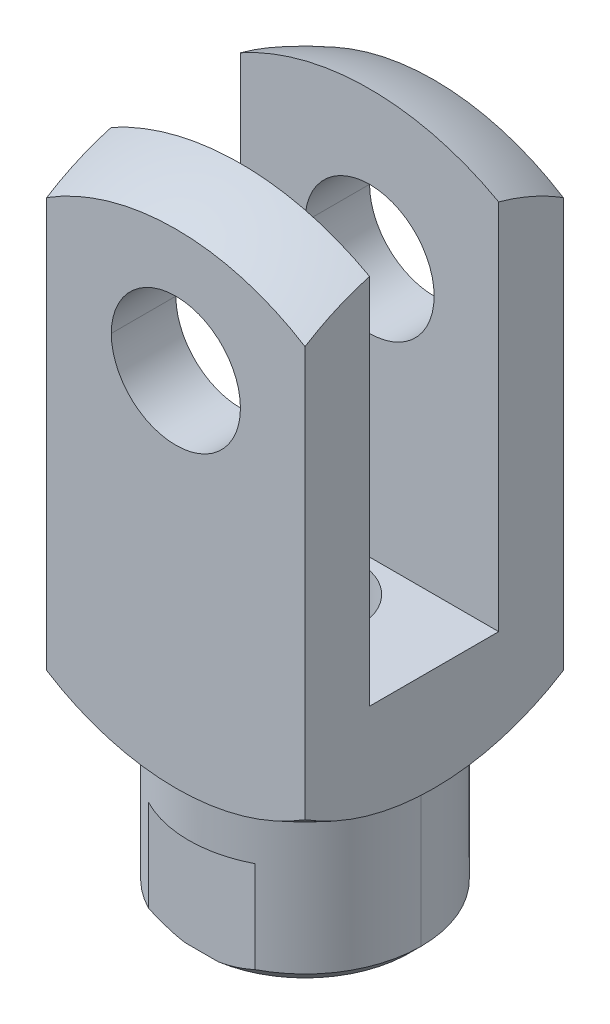
ISO-10303-21;
HEADER;
FILE_DESCRIPTION(('STEP AP214'),'2;1');
FILE_NAME('part.step','',(''),(''),'','','');
FILE_SCHEMA(('AUTOMOTIVE_DESIGN { 1 0 10303 214 1 1 1 1 }'));
ENDSEC;
DATA;
#1=APPLICATION_CONTEXT('core data for automotive mechanical design processes');
#2=APPLICATION_PROTOCOL_DEFINITION('international standard','automotive_design',2000,#1);
#3=PRODUCT_CONTEXT('',#1,'mechanical');
#4=PRODUCT('Part','Part','',(#3));
#5=PRODUCT_RELATED_PRODUCT_CATEGORY('part','',(#4));
#6=PRODUCT_DEFINITION_FORMATION('','',#4);
#7=PRODUCT_DEFINITION_CONTEXT('part definition',#1,'design');
#8=PRODUCT_DEFINITION('design','',#6,#7);
#9=PRODUCT_DEFINITION_SHAPE('','',#8);
#10=(LENGTH_UNIT() NAMED_UNIT(*) SI_UNIT(.MILLI.,.METRE.));
#11=(NAMED_UNIT(*) PLANE_ANGLE_UNIT() SI_UNIT($,.RADIAN.));
#12=(NAMED_UNIT(*) SI_UNIT($,.STERADIAN.) SOLID_ANGLE_UNIT());
#13=UNCERTAINTY_MEASURE_WITH_UNIT(LENGTH_MEASURE(1.E-05),#10,'distance_accuracy_value','');
#14=(GEOMETRIC_REPRESENTATION_CONTEXT(3) GLOBAL_UNCERTAINTY_ASSIGNED_CONTEXT((#13)) GLOBAL_UNIT_ASSIGNED_CONTEXT((#10,
#11,#12)) REPRESENTATION_CONTEXT('',''));
#15=CARTESIAN_POINT('',(0.,0.,0.));
#16=DIRECTION('',(0.,0.,1.));
#17=DIRECTION('',(1.,0.,0.));
#18=AXIS2_PLACEMENT_3D('',#15,#16,#17);
#19=CARTESIAN_POINT('',(0.,8.,0.));
#20=DIRECTION('',(0.,1.,0.));
#21=DIRECTION('',(1.,0.,0.));
#22=AXIS2_PLACEMENT_3D('',#19,#20,#21);
#23=PLANE('',#22);
#24=DIRECTION('',(-1.,0.,0.));
#25=VECTOR('',#24,1.);
#26=CARTESIAN_POINT('',(-10.,8.,-8.));
#27=LINE('',#26,#25);
#28=CARTESIAN_POINT('',(4.12310562561766,8.,-8.));
#29=VERTEX_POINT('',#28);
#30=CARTESIAN_POINT('',(-4.12310562561766,8.,-8.));
#31=VERTEX_POINT('',#30);
#32=EDGE_CURVE('E11',#29,#31,#27,.T.);
#33=ORIENTED_EDGE('',*,*,#32,.T.);
#34=CARTESIAN_POINT('',(0.,8.,0.));
#35=DIRECTION('',(0.,1.,0.));
#36=DIRECTION('',(-1.,0.,0.));
#37=AXIS2_PLACEMENT_3D('',#34,#35,#36);
#38=CIRCLE('',#37,9.);
#39=EDGE_CURVE('E413',#29,#31,#38,.T.);
#40=ORIENTED_EDGE('',*,*,#39,.F.);
#41=EDGE_LOOP('',(#33,#40));
#42=FACE_BOUND('',#41,.T.);
#43=ADVANCED_FACE('F16',(#42),#23,.F.);
#44=CARTESIAN_POINT('',(-10.,8.,-8.));
#45=DIRECTION('',(0.,0.,1.));
#46=DIRECTION('',(1.,0.,0.));
#47=AXIS2_PLACEMENT_3D('',#44,#45,#46);
#48=PLANE('',#47);
#49=DIRECTION('',(0.,-1.,0.));
#50=VECTOR('',#49,1.);
#51=CARTESIAN_POINT('',(-4.12310562561766,0.,-8.));
#52=LINE('',#51,#50);
#53=CARTESIAN_POINT('',(-4.12310562561766,0.9,-8.));
#54=VERTEX_POINT('',#53);
#55=EDGE_CURVE('E417',#31,#54,#52,.T.);
#56=ORIENTED_EDGE('',*,*,#55,.F.);
#57=ORIENTED_EDGE('',*,*,#32,.F.);
#58=DIRECTION('',(0.,1.,0.));
#59=VECTOR('',#58,1.);
#60=CARTESIAN_POINT('',(4.12310562561766,0.,-8.));
#61=LINE('',#60,#59);
#62=CARTESIAN_POINT('',(4.12310562561766,0.9,-8.));
#63=VERTEX_POINT('',#62);
#64=EDGE_CURVE('E418',#63,#29,#61,.T.);
#65=ORIENTED_EDGE('',*,*,#64,.F.);
#66=CARTESIAN_POINT('',(1.26885775404497,0.,-7.99999999999999));
#67=CARTESIAN_POINT('',(1.38994079562698,0.018952370685525,-7.9999924620699));
#68=CARTESIAN_POINT('',(1.51060797952198,0.0404925729831424,-7.99997400709315));
#69=CARTESIAN_POINT('',(1.75208405197413,0.0886969845870874,-7.99994077036149));
#70=CARTESIAN_POINT('',(1.87288381257544,0.115407005041644,-7.99992602438148));
#71=CARTESIAN_POINT('',(2.11502687699107,0.17394470197868,-7.99992682084828));
#72=CARTESIAN_POINT('',(2.23635402017717,0.205838934143355,-7.99994279123284));
#73=CARTESIAN_POINT('',(2.47994871662187,0.274717636945773,-7.99997784770731));
#74=CARTESIAN_POINT('',(2.60219289627614,0.311784523903941,-7.99999698543147));
#75=CARTESIAN_POINT('',(2.83969284605131,0.388336415003649,-8.00000287520217));
#76=CARTESIAN_POINT('',(2.95501042442044,0.427630404221857,-7.99999108356618));
#77=CARTESIAN_POINT('',(3.18637134355346,0.510499443251983,-7.99997542141181));
#78=CARTESIAN_POINT('',(3.30239214992866,0.55413730685093,-7.99997169292064));
#79=CARTESIAN_POINT('',(3.53540646382418,0.645682656151512,-7.99997360474411));
#80=CARTESIAN_POINT('',(3.65237325835266,0.693657912564896,-7.99997943329883));
#81=CARTESIAN_POINT('',(3.88751279983666,0.793878774554377,-7.99999172230734));
#82=CARTESIAN_POINT('',(4.0056554339193,0.846195125260534,-7.99999819384492));
#83=CARTESIAN_POINT('',(4.12310562561764,0.899999999999998,-8.00000000000001));
#84=B_SPLINE_CURVE_WITH_KNOTS('',3,(#66,#67,#68,#69,#70,#71,#72,#73,#74,#75,#76,#77,#78,#79,#80,
#81,#82,#83),.UNSPECIFIED.,.F.,.F.,(4,2,2,2,2,2,2,2,4),(0.,0.367628617721908,0.73867780793285,
1.11493388796358,1.49807027707616,1.86349390799682,2.23530352795859,2.61452482973741,
3.00209206908685),.UNSPECIFIED.);
#85=CARTESIAN_POINT('',(1.26885775404493,0.,-8.));
#86=VERTEX_POINT('',#85);
#87=EDGE_CURVE('E499',#86,#63,#84,.T.);
#88=ORIENTED_EDGE('',*,*,#87,.F.);
#89=DIRECTION('',(-1.,0.,0.));
#90=VECTOR('',#89,1.);
#91=CARTESIAN_POINT('',(-10.,0.,-8.));
#92=LINE('',#91,#90);
#93=CARTESIAN_POINT('',(-1.26885775404493,0.,-8.));
#94=VERTEX_POINT('',#93);
#95=EDGE_CURVE('E411',#86,#94,#92,.T.);
#96=ORIENTED_EDGE('',*,*,#95,.T.);
#97=CARTESIAN_POINT('',(-4.12310562561768,0.899999999999998,-7.99999999999998));
#98=CARTESIAN_POINT('',(-4.00603290963789,0.846368043362673,-7.99999823368739));
#99=CARTESIAN_POINT('',(-3.88827212760985,0.794215397388533,-7.99999218842099));
#100=CARTESIAN_POINT('',(-3.65388495897332,0.694291264423498,-7.9999809060938));
#101=CARTESIAN_POINT('',(-3.53728835058451,0.646449836042908,-7.99997565448842));
#102=CARTESIAN_POINT('',(-3.305005513942,0.555141617105366,-7.99997448191074));
#103=CARTESIAN_POINT('',(-3.18934571047075,0.51160782251034,-7.99997838138673));
#104=CARTESIAN_POINT('',(-2.95870067995103,0.42891607934736,-7.99999313952195));
#105=CARTESIAN_POINT('',(-2.843737756472,0.389696017041601,-8.00000387799841));
#106=CARTESIAN_POINT('',(-2.60623193439564,0.313029410704927,-7.99999590922408));
#107=CARTESIAN_POINT('',(-2.48361923260904,0.275798247127071,-7.99997555402123));
#108=CARTESIAN_POINT('',(-2.23929039196375,0.206622095071238,-7.99993937192195));
#109=CARTESIAN_POINT('',(-2.11759785077737,0.174594007918768,-7.99992347010108));
#110=CARTESIAN_POINT('',(-1.87472380861215,0.115819275535574,-7.9999234377792));
#111=CARTESIAN_POINT('',(-1.75355860679095,0.0890055742955247,-7.99993886992678));
#112=CARTESIAN_POINT('',(-1.51134820297133,0.0406241405309705,-7.99997333974946));
#113=CARTESIAN_POINT('',(-1.39031218604122,0.0190103388817107,-7.99999234288556));
#114=CARTESIAN_POINT('',(-1.26885775404489,0.,-8.00000000000001));
#115=B_SPLINE_CURVE_WITH_KNOTS('',3,(#97,#98,#99,#100,#101,#102,#103,#104,#105,#106,#107,#108,
#109,#110,#111,#112,#113,#114),.UNSPECIFIED.,.F.,.F.,(4,2,2,2,2,2,2,2,4),(0.,0.386321535227392,
0.764363481724133,1.13505012610248,1.49939591168594,1.88373257122285,2.26115015595665,
2.63333606232472,3.00209192769503),.UNSPECIFIED.);
#116=EDGE_CURVE('E535',#54,#94,#115,.T.);
#117=ORIENTED_EDGE('',*,*,#116,.F.);
#118=EDGE_LOOP('',(#56,#57,#65,#88,#96,#117));
#119=FACE_BOUND('',#118,.T.);
#120=ADVANCED_FACE('F504',(#119),#48,.F.);
#121=CARTESIAN_POINT('',(0.,8.,0.));
#122=DIRECTION('',(0.,-1.,0.));
#123=DIRECTION('',(0.,0.,-1.));
#124=AXIS2_PLACEMENT_3D('',#121,#122,#123);
#125=PLANE('',#124);
#126=CARTESIAN_POINT('',(0.,8.,0.));
#127=DIRECTION('',(0.,-1.,0.));
#128=DIRECTION('',(1.,0.,0.));
#129=AXIS2_PLACEMENT_3D('',#126,#127,#128);
#130=CIRCLE('',#129,9.);
#131=CARTESIAN_POINT('',(4.12310562561766,8.,8.));
#132=VERTEX_POINT('',#131);
#133=CARTESIAN_POINT('',(-4.12310562561766,8.,8.));
#134=VERTEX_POINT('',#133);
#135=EDGE_CURVE('E263',#132,#134,#130,.T.);
#136=ORIENTED_EDGE('',*,*,#135,.T.);
#137=DIRECTION('',(1.,0.,0.));
#138=VECTOR('',#137,1.);
#139=CARTESIAN_POINT('',(-10.,8.,8.));
#140=LINE('',#139,#138);
#141=EDGE_CURVE('E25',#134,#132,#140,.T.);
#142=ORIENTED_EDGE('',*,*,#141,.T.);
#143=EDGE_LOOP('',(#136,#142));
#144=FACE_BOUND('',#143,.T.);
#145=ADVANCED_FACE('F513',(#144),#125,.T.);
#146=CARTESIAN_POINT('',(-10.,8.,8.));
#147=DIRECTION('',(0.,0.,-1.));
#148=DIRECTION('',(0.,-1.,0.));
#149=AXIS2_PLACEMENT_3D('',#146,#147,#148);
#150=PLANE('',#149);
#151=DIRECTION('',(0.,-1.,0.));
#152=VECTOR('',#151,1.);
#153=CARTESIAN_POINT('',(4.12310562561766,0.,8.));
#154=LINE('',#153,#152);
#155=CARTESIAN_POINT('',(4.12310562561766,0.9,8.));
#156=VERTEX_POINT('',#155);
#157=EDGE_CURVE('E266',#132,#156,#154,.T.);
#158=ORIENTED_EDGE('',*,*,#157,.F.);
#159=ORIENTED_EDGE('',*,*,#141,.F.);
#160=DIRECTION('',(0.,1.,0.));
#161=VECTOR('',#160,1.);
#162=CARTESIAN_POINT('',(-4.12310562561766,0.,8.));
#163=LINE('',#162,#161);
#164=CARTESIAN_POINT('',(-4.12310562561766,0.9,8.));
#165=VERTEX_POINT('',#164);
#166=EDGE_CURVE('E267',#165,#134,#163,.T.);
#167=ORIENTED_EDGE('',*,*,#166,.F.);
#168=CARTESIAN_POINT('',(-1.26885775404493,0.,8.));
#169=CARTESIAN_POINT('',(-1.38994079563,0.0189523706859841,7.99999246206989));
#170=CARTESIAN_POINT('',(-1.51060797952807,0.0404925729840456,7.99997400709297));
#171=CARTESIAN_POINT('',(-1.75208405198433,0.0886969845886402,7.99994077036086));
#172=CARTESIAN_POINT('',(-1.8728838125867,0.11540700504332,7.99992602438058));
#173=CARTESIAN_POINT('',(-2.11502687700239,0.173944701980327,7.99992682084697));
#174=CARTESIAN_POINT('',(-2.23635402018752,0.205838934144772,7.9999427912314));
#175=CARTESIAN_POINT('',(-2.4799487166281,0.274717636946651,7.99997784770625));
#176=CARTESIAN_POINT('',(-2.60219289627925,0.311784523904444,7.99999698543095));
#177=CARTESIAN_POINT('',(-2.83969284605436,0.388336415005105,8.00000287520267));
#178=CARTESIAN_POINT('',(-2.95501042442649,0.427630404224852,7.99999108356718));
#179=CARTESIAN_POINT('',(-3.18637134356357,0.510499443256999,7.99997542141319));
#180=CARTESIAN_POINT('',(-3.30239214993987,0.554137306856356,7.9999716929219));
#181=CARTESIAN_POINT('',(-3.5354064638355,0.645682656156899,7.99997360474498));
#182=CARTESIAN_POINT('',(-3.65237325836302,0.693657912569769,7.99997943329945));
#183=CARTESIAN_POINT('',(-3.88751279984292,0.793878774557308,7.99999172230752));
#184=CARTESIAN_POINT('',(-4.00565543392244,0.846195125261976,7.99999819384492));
#185=CARTESIAN_POINT('',(-4.12310562561766,0.899999999999998,8.));
#186=B_SPLINE_CURVE_WITH_KNOTS('',3,(#168,#169,#170,#171,#172,#173,#174,#175,#176,#177,#178,
#179,#180,#181,#182,#183,#184,#185),.UNSPECIFIED.,.F.,.F.,(4,2,2,2,2,2,2,2,4),(0.,
0.367628617731206,0.738677807945324,1.11493388797303,1.49807027707632,1.86349390800698,
2.23530352797227,2.61452482974784,3.00209206908693),.UNSPECIFIED.);
#187=CARTESIAN_POINT('',(-1.26885775404493,0.,8.));
#188=VERTEX_POINT('',#187);
#189=EDGE_CURVE('E312',#188,#165,#186,.T.);
#190=ORIENTED_EDGE('',*,*,#189,.F.);
#191=DIRECTION('',(1.,0.,0.));
#192=VECTOR('',#191,1.);
#193=CARTESIAN_POINT('',(-10.,0.,8.));
#194=LINE('',#193,#192);
#195=CARTESIAN_POINT('',(1.26885775404493,0.,8.));
#196=VERTEX_POINT('',#195);
#197=EDGE_CURVE('E628',#188,#196,#194,.T.);
#198=ORIENTED_EDGE('',*,*,#197,.T.);
#199=CARTESIAN_POINT('',(4.12310562561767,0.899999999999998,7.99999999999999));
#200=CARTESIAN_POINT('',(4.00603290962739,0.84636804335784,7.99999823368736));
#201=CARTESIAN_POINT('',(3.8882721275889,0.794215397378712,7.99999218842038));
#202=CARTESIAN_POINT('',(3.6538849589386,0.694291264407167,7.99998090609175));
#203=CARTESIAN_POINT('',(3.53728835054655,0.646449836024857,7.99997565448551));
#204=CARTESIAN_POINT('',(3.3050055139044,0.555141617087186,7.99997448190656));
#205=CARTESIAN_POINT('',(3.18934571043684,0.511607822493538,7.99997838138213));
#206=CARTESIAN_POINT('',(2.95870067993078,0.428916079337332,7.99999313951863));
#207=CARTESIAN_POINT('',(2.84373775646181,0.389696017036729,8.00000387799674));
#208=CARTESIAN_POINT('',(2.60623193438525,0.313029410703249,7.99999590922586));
#209=CARTESIAN_POINT('',(2.48361923258818,0.275798247124137,7.99997555402478));
#210=CARTESIAN_POINT('',(2.23929039192906,0.206622095066498,7.9999393719268));
#211=CARTESIAN_POINT('',(2.11759785073939,0.174594007913257,7.99992347010548));
#212=CARTESIAN_POINT('',(1.87472380857435,0.115819275529964,7.99992343778225));
#213=CARTESIAN_POINT('',(1.75355860675668,0.0890055742903259,7.99993886992891));
#214=CARTESIAN_POINT('',(1.51134820295083,0.0406241405279442,7.9999733397501));
#215=CARTESIAN_POINT('',(1.39031218603099,0.0190103388801698,7.99999234288561));
#216=CARTESIAN_POINT('',(1.26885775404492,0.,8.));
#217=B_SPLINE_CURVE_WITH_KNOTS('',3,(#199,#200,#201,#202,#203,#204,#205,#206,#207,#208,#209,
#210,#211,#212,#213,#214,#215,#216),.UNSPECIFIED.,.F.,.F.,(4,2,2,2,2,2,2,2,4),(0.,
0.386321535262088,0.764363481769783,1.13505012613628,1.49939591168617,1.88373257125427,
2.26115015599826,2.6333360623557,3.00209192769489),.UNSPECIFIED.);
#218=EDGE_CURVE('E462',#156,#196,#217,.T.);
#219=ORIENTED_EDGE('',*,*,#218,.F.);
#220=EDGE_LOOP('',(#158,#159,#167,#190,#198,#219));
#221=FACE_BOUND('',#220,.T.);
#222=ADVANCED_FACE('F600',(#221),#150,.F.);
#223=CARTESIAN_POINT('',(0.,40.,-25.));
#224=DIRECTION('',(0.,0.,1.));
#225=DIRECTION('',(1.,0.,0.));
#226=AXIS2_PLACEMENT_3D('',#223,#224,#225);
#227=CYLINDRICAL_SURFACE('',#226,5.);
#228=DIRECTION('',(0.,0.,1.));
#229=VECTOR('',#228,1.);
#230=CARTESIAN_POINT('',(-5.,40.,-25.));
#231=LINE('',#230,#229);
#232=CARTESIAN_POINT('',(-5.,40.,-10.));
#233=VERTEX_POINT('',#232);
#234=CARTESIAN_POINT('',(-5.,40.,-5.));
#235=VERTEX_POINT('',#234);
#236=EDGE_CURVE('E245',#233,#235,#231,.T.);
#237=ORIENTED_EDGE('',*,*,#236,.F.);
#238=CARTESIAN_POINT('',(0.,40.,-10.));
#239=DIRECTION('',(0.,0.,1.));
#240=DIRECTION('',(1.,0.,0.));
#241=AXIS2_PLACEMENT_3D('',#238,#239,#240);
#242=CIRCLE('',#241,5.);
#243=CARTESIAN_POINT('',(5.,40.,-10.));
#244=VERTEX_POINT('',#243);
#245=EDGE_CURVE('E231',#244,#233,#242,.T.);
#246=ORIENTED_EDGE('',*,*,#245,.F.);
#247=DIRECTION('',(0.,0.,1.));
#248=VECTOR('',#247,1.);
#249=CARTESIAN_POINT('',(5.,40.,-25.));
#250=LINE('',#249,#248);
#251=CARTESIAN_POINT('',(5.,40.,-5.));
#252=VERTEX_POINT('',#251);
#253=EDGE_CURVE('E255',#244,#252,#250,.T.);
#254=ORIENTED_EDGE('',*,*,#253,.T.);
#255=CARTESIAN_POINT('',(0.,40.,-5.));
#256=DIRECTION('',(0.,0.,-1.));
#257=DIRECTION('',(0.,1.,0.));
#258=AXIS2_PLACEMENT_3D('',#255,#256,#257);
#259=CIRCLE('',#258,5.);
#260=EDGE_CURVE('E247',#235,#252,#259,.T.);
#261=ORIENTED_EDGE('',*,*,#260,.F.);
#262=EDGE_LOOP('',(#237,#246,#254,#261));
#263=FACE_BOUND('',#262,.T.);
#264=ADVANCED_FACE('F246',(#263),#227,.F.);
#265=CARTESIAN_POINT('',(0.,40.,-25.));
#266=DIRECTION('',(0.,0.,1.));
#267=DIRECTION('',(1.,0.,0.));
#268=AXIS2_PLACEMENT_3D('',#265,#266,#267);
#269=CYLINDRICAL_SURFACE('',#268,5.);
#270=DIRECTION('',(0.,0.,1.));
#271=VECTOR('',#270,1.);
#272=CARTESIAN_POINT('',(-5.,40.,-25.));
#273=LINE('',#272,#271);
#274=CARTESIAN_POINT('',(-5.,40.,5.));
#275=VERTEX_POINT('',#274);
#276=CARTESIAN_POINT('',(-5.,40.,10.));
#277=VERTEX_POINT('',#276);
#278=EDGE_CURVE('E306',#275,#277,#273,.T.);
#279=ORIENTED_EDGE('',*,*,#278,.F.);
#280=CARTESIAN_POINT('',(0.,40.,5.));
#281=DIRECTION('',(0.,0.,1.));
#282=DIRECTION('',(0.,-1.,0.));
#283=AXIS2_PLACEMENT_3D('',#280,#281,#282);
#284=CIRCLE('',#283,5.);
#285=CARTESIAN_POINT('',(5.,40.,5.));
#286=VERTEX_POINT('',#285);
#287=EDGE_CURVE('E453',#286,#275,#284,.T.);
#288=ORIENTED_EDGE('',*,*,#287,.F.);
#289=DIRECTION('',(0.,0.,1.));
#290=VECTOR('',#289,1.);
#291=CARTESIAN_POINT('',(5.,40.,-25.));
#292=LINE('',#291,#290);
#293=CARTESIAN_POINT('',(5.,40.,10.));
#294=VERTEX_POINT('',#293);
#295=EDGE_CURVE('E320',#286,#294,#292,.T.);
#296=ORIENTED_EDGE('',*,*,#295,.T.);
#297=CARTESIAN_POINT('',(0.,40.,10.));
#298=DIRECTION('',(0.,0.,-1.));
#299=DIRECTION('',(-1.,0.,0.));
#300=AXIS2_PLACEMENT_3D('',#297,#298,#299);
#301=CIRCLE('',#300,5.);
#302=EDGE_CURVE('E323',#277,#294,#301,.T.);
#303=ORIENTED_EDGE('',*,*,#302,.F.);
#304=EDGE_LOOP('',(#279,#288,#296,#303));
#305=FACE_BOUND('',#304,.T.);
#306=ADVANCED_FACE('F670',(#305),#269,.F.);
#307=CARTESIAN_POINT('',(-25.,20.,5.));
#308=DIRECTION('',(0.,0.,1.));
#309=DIRECTION('',(0.,-1.,0.));
#310=AXIS2_PLACEMENT_3D('',#307,#308,#309);
#311=PLANE('',#310);
#312=ORIENTED_EDGE('',*,*,#287,.T.);
#313=CARTESIAN_POINT('',(0.,40.,5.));
#314=DIRECTION('',(0.,0.,1.));
#315=DIRECTION('',(0.,-1.,0.));
#316=AXIS2_PLACEMENT_3D('',#313,#314,#315);
#317=CIRCLE('',#316,5.);
#318=EDGE_CURVE('E302',#275,#286,#317,.T.);
#319=ORIENTED_EDGE('',*,*,#318,.T.);
#320=EDGE_LOOP('',(#312,#319));
#321=FACE_BOUND('',#320,.T.);
#322=DIRECTION('',(1.,0.,0.));
#323=VECTOR('',#322,1.);
#324=CARTESIAN_POINT('',(-25.,20.,5.));
#325=LINE('',#324,#323);
#326=CARTESIAN_POINT('',(-10.,20.,5.));
#327=VERTEX_POINT('',#326);
#328=CARTESIAN_POINT('',(10.,20.,5.));
#329=VERTEX_POINT('',#328);
#330=EDGE_CURVE('E262',#327,#329,#325,.T.);
#331=ORIENTED_EDGE('',*,*,#330,.F.);
#332=DIRECTION('',(0.,-1.,0.));
#333=VECTOR('',#332,1.);
#334=CARTESIAN_POINT('',(-10.,52.,5.));
#335=LINE('',#334,#333);
#336=CARTESIAN_POINT('',(-10.,48.8210403685012,5.));
#337=VERTEX_POINT('',#336);
#338=EDGE_CURVE('E324',#337,#327,#335,.T.);
#339=ORIENTED_EDGE('',*,*,#338,.F.);
#340=CARTESIAN_POINT('',(0.,30.75,5.));
#341=DIRECTION('',(0.,0.,1.));
#342=DIRECTION('',(0.,-1.,0.));
#343=AXIS2_PLACEMENT_3D('',#340,#341,#342);
#344=CIRCLE('',#343,20.6533895523229);
#345=CARTESIAN_POINT('',(10.,48.8210403685012,5.));
#346=VERTEX_POINT('',#345);
#347=EDGE_CURVE('E36',#346,#337,#344,.T.);
#348=ORIENTED_EDGE('',*,*,#347,.F.);
#349=DIRECTION('',(0.,1.,0.));
#350=VECTOR('',#349,1.);
#351=CARTESIAN_POINT('',(10.,52.,5.));
#352=LINE('',#351,#350);
#353=EDGE_CURVE('E295',#329,#346,#352,.T.);
#354=ORIENTED_EDGE('',*,*,#353,.F.);
#355=EDGE_LOOP('',(#331,#339,#348,#354));
#356=FACE_BOUND('',#355,.T.);
#357=ADVANCED_FACE('F676',(#321,#356),#311,.F.);
#358=CARTESIAN_POINT('',(-25.,20.,-5.));
#359=DIRECTION('',(0.,0.,-1.));
#360=DIRECTION('',(0.,-1.,0.));
#361=AXIS2_PLACEMENT_3D('',#358,#359,#360);
#362=PLANE('',#361);
#363=CARTESIAN_POINT('',(0.,40.,-5.));
#364=DIRECTION('',(0.,0.,-1.));
#365=DIRECTION('',(0.,1.,0.));
#366=AXIS2_PLACEMENT_3D('',#363,#364,#365);
#367=CIRCLE('',#366,5.);
#368=EDGE_CURVE('E252',#252,#235,#367,.T.);
#369=ORIENTED_EDGE('',*,*,#368,.T.);
#370=ORIENTED_EDGE('',*,*,#260,.T.);
#371=EDGE_LOOP('',(#369,#370));
#372=FACE_BOUND('',#371,.T.);
#373=CARTESIAN_POINT('',(0.,30.75,-5.));
#374=DIRECTION('',(0.,0.,-1.));
#375=DIRECTION('',(0.,1.,0.));
#376=AXIS2_PLACEMENT_3D('',#373,#374,#375);
#377=CIRCLE('',#376,20.6533895523229);
#378=CARTESIAN_POINT('',(-10.,48.8210403685012,-5.));
#379=VERTEX_POINT('',#378);
#380=CARTESIAN_POINT('',(10.,48.8210403685012,-5.));
#381=VERTEX_POINT('',#380);
#382=EDGE_CURVE('E311',#379,#381,#377,.T.);
#383=ORIENTED_EDGE('',*,*,#382,.F.);
#384=DIRECTION('',(0.,1.,0.));
#385=VECTOR('',#384,1.);
#386=CARTESIAN_POINT('',(-10.,52.,-5.));
#387=LINE('',#386,#385);
#388=CARTESIAN_POINT('',(-10.,20.,-5.));
#389=VERTEX_POINT('',#388);
#390=EDGE_CURVE('E433',#389,#379,#387,.T.);
#391=ORIENTED_EDGE('',*,*,#390,.F.);
#392=DIRECTION('',(1.,0.,0.));
#393=VECTOR('',#392,1.);
#394=CARTESIAN_POINT('',(-25.,20.,-5.));
#395=LINE('',#394,#393);
#396=CARTESIAN_POINT('',(10.,20.,-5.));
#397=VERTEX_POINT('',#396);
#398=EDGE_CURVE('E260',#389,#397,#395,.T.);
#399=ORIENTED_EDGE('',*,*,#398,.T.);
#400=DIRECTION('',(0.,-1.,0.));
#401=VECTOR('',#400,1.);
#402=CARTESIAN_POINT('',(10.,52.,-5.));
#403=LINE('',#402,#401);
#404=EDGE_CURVE('E419',#381,#397,#403,.T.);
#405=ORIENTED_EDGE('',*,*,#404,.F.);
#406=EDGE_LOOP('',(#383,#391,#399,#405));
#407=FACE_BOUND('',#406,.T.);
#408=ADVANCED_FACE('F683',(#372,#407),#362,.F.);
#409=CARTESIAN_POINT('',(-25.,20.,5.));
#410=DIRECTION('',(0.,-1.,0.));
#411=DIRECTION('',(0.,0.,-1.));
#412=AXIS2_PLACEMENT_3D('',#409,#410,#411);
#413=PLANE('',#412);
#414=CARTESIAN_POINT('',(0.,20.,0.));
#415=DIRECTION('',(0.,1.,0.));
#416=DIRECTION('',(0.,0.,-1.));
#417=AXIS2_PLACEMENT_3D('',#414,#415,#416);
#418=CIRCLE('',#417,4.2);
#419=CARTESIAN_POINT('',(4.2,20.,0.));
#420=VERTEX_POINT('',#419);
#421=CARTESIAN_POINT('',(-4.2,20.,0.));
#422=VERTEX_POINT('',#421);
#423=EDGE_CURVE('E360',#420,#422,#418,.T.);
#424=ORIENTED_EDGE('',*,*,#423,.F.);
#425=CARTESIAN_POINT('',(0.,20.,0.));
#426=DIRECTION('',(0.,1.,0.));
#427=DIRECTION('',(0.,0.,-1.));
#428=AXIS2_PLACEMENT_3D('',#425,#426,#427);
#429=CIRCLE('',#428,4.2);
#430=EDGE_CURVE('E273',#422,#420,#429,.T.);
#431=ORIENTED_EDGE('',*,*,#430,.F.);
#432=EDGE_LOOP('',(#424,#431));
#433=FACE_BOUND('',#432,.T.);
#434=ORIENTED_EDGE('',*,*,#398,.F.);
#435=DIRECTION('',(0.,0.,-1.));
#436=VECTOR('',#435,1.);
#437=CARTESIAN_POINT('',(-10.,20.,-10.));
#438=LINE('',#437,#436);
#439=EDGE_CURVE('E241',#327,#389,#438,.T.);
#440=ORIENTED_EDGE('',*,*,#439,.F.);
#441=ORIENTED_EDGE('',*,*,#330,.T.);
#442=DIRECTION('',(0.,0.,1.));
#443=VECTOR('',#442,1.);
#444=CARTESIAN_POINT('',(10.,20.,-10.));
#445=LINE('',#444,#443);
#446=EDGE_CURVE('E423',#397,#329,#445,.T.);
#447=ORIENTED_EDGE('',*,*,#446,.F.);
#448=EDGE_LOOP('',(#434,#440,#441,#447));
#449=FACE_BOUND('',#448,.T.);
#450=ADVANCED_FACE('F691',(#433,#449),#413,.F.);
#451=CARTESIAN_POINT('',(0.,30.75,0.));
#452=DIRECTION('',(0.,0.,-1.));
#453=DIRECTION('',(-1.,0.,0.));
#454=AXIS2_PLACEMENT_3D('',#451,#452,#453);
#455=SPHERICAL_SURFACE('',#454,21.25);
#456=CARTESIAN_POINT('',(10.,30.75,0.));
#457=DIRECTION('',(-1.,0.,0.));
#458=DIRECTION('',(0.,0.,1.));
#459=AXIS2_PLACEMENT_3D('',#456,#457,#458);
#460=CIRCLE('',#459,18.75);
#461=CARTESIAN_POINT('',(10.,46.6107219255619,10.));
#462=VERTEX_POINT('',#461);
#463=EDGE_CURVE('E291',#462,#346,#460,.T.);
#464=ORIENTED_EDGE('',*,*,#463,.T.);
#465=ORIENTED_EDGE('',*,*,#347,.T.);
#466=CARTESIAN_POINT('',(-10.,30.75,0.));
#467=DIRECTION('',(1.,0.,0.));
#468=DIRECTION('',(0.,0.,-1.));
#469=AXIS2_PLACEMENT_3D('',#466,#467,#468);
#470=CIRCLE('',#469,18.75);
#471=CARTESIAN_POINT('',(-10.,46.6107219255619,10.));
#472=VERTEX_POINT('',#471);
#473=EDGE_CURVE('E439',#337,#472,#470,.T.);
#474=ORIENTED_EDGE('',*,*,#473,.T.);
#475=CARTESIAN_POINT('',(0.,30.75,10.));
#476=DIRECTION('',(0.,0.,-1.));
#477=DIRECTION('',(-1.,0.,0.));
#478=AXIS2_PLACEMENT_3D('',#475,#476,#477);
#479=CIRCLE('',#478,18.75);
#480=EDGE_CURVE('E45',#472,#462,#479,.T.);
#481=ORIENTED_EDGE('',*,*,#480,.T.);
#482=EDGE_LOOP('',(#464,#465,#474,#481));
#483=FACE_BOUND('',#482,.T.);
#484=ADVANCED_FACE('F699',(#483),#455,.T.);
#485=CARTESIAN_POINT('',(-10.,52.,10.));
#486=DIRECTION('',(0.,0.,-1.));
#487=DIRECTION('',(0.,-1.,0.));
#488=AXIS2_PLACEMENT_3D('',#485,#486,#487);
#489=PLANE('',#488);
#490=CARTESIAN_POINT('',(0.,40.,10.));
#491=DIRECTION('',(0.,0.,-1.));
#492=DIRECTION('',(-1.,0.,0.));
#493=AXIS2_PLACEMENT_3D('',#490,#491,#492);
#494=CIRCLE('',#493,5.);
#495=EDGE_CURVE('E316',#294,#277,#494,.T.);
#496=ORIENTED_EDGE('',*,*,#495,.T.);
#497=ORIENTED_EDGE('',*,*,#302,.T.);
#498=EDGE_LOOP('',(#496,#497));
#499=FACE_BOUND('',#498,.T.);
#500=DIRECTION('',(0.,-1.,0.));
#501=VECTOR('',#500,1.);
#502=CARTESIAN_POINT('',(-10.,52.,10.));
#503=LINE('',#502,#501);
#504=CARTESIAN_POINT('',(-10.,14.8892780744381,10.));
#505=VERTEX_POINT('',#504);
#506=EDGE_CURVE('E436',#472,#505,#503,.T.);
#507=ORIENTED_EDGE('',*,*,#506,.T.);
#508=CARTESIAN_POINT('',(0.,30.75,10.));
#509=DIRECTION('',(0.,0.,-1.));
#510=DIRECTION('',(-1.,0.,0.));
#511=AXIS2_PLACEMENT_3D('',#508,#509,#510);
#512=CIRCLE('',#511,18.75);
#513=CARTESIAN_POINT('',(10.,14.8892780744381,10.));
#514=VERTEX_POINT('',#513);
#515=EDGE_CURVE('E278',#514,#505,#512,.T.);
#516=ORIENTED_EDGE('',*,*,#515,.F.);
#517=DIRECTION('',(0.,-1.,0.));
#518=VECTOR('',#517,1.);
#519=CARTESIAN_POINT('',(10.,52.,10.));
#520=LINE('',#519,#518);
#521=EDGE_CURVE('E294',#462,#514,#520,.T.);
#522=ORIENTED_EDGE('',*,*,#521,.F.);
#523=ORIENTED_EDGE('',*,*,#480,.F.);
#524=EDGE_LOOP('',(#507,#516,#522,#523));
#525=FACE_BOUND('',#524,.T.);
#526=ADVANCED_FACE('F707',(#499,#525),#489,.F.);
#527=CARTESIAN_POINT('',(-10.,52.,-10.));
#528=DIRECTION('',(1.,0.,0.));
#529=DIRECTION('',(0.,0.,-1.));
#530=AXIS2_PLACEMENT_3D('',#527,#528,#529);
#531=PLANE('',#530);
#532=ORIENTED_EDGE('',*,*,#439,.T.);
#533=ORIENTED_EDGE('',*,*,#390,.T.);
#534=CARTESIAN_POINT('',(-10.,30.75,0.));
#535=DIRECTION('',(1.,0.,0.));
#536=DIRECTION('',(0.,0.,-1.));
#537=AXIS2_PLACEMENT_3D('',#534,#535,#536);
#538=CIRCLE('',#537,18.75);
#539=CARTESIAN_POINT('',(-10.,46.6107219255619,-10.));
#540=VERTEX_POINT('',#539);
#541=EDGE_CURVE('E307',#540,#379,#538,.T.);
#542=ORIENTED_EDGE('',*,*,#541,.F.);
#543=DIRECTION('',(0.,-1.,0.));
#544=VECTOR('',#543,1.);
#545=CARTESIAN_POINT('',(-10.,52.,-10.));
#546=LINE('',#545,#544);
#547=CARTESIAN_POINT('',(-10.,14.8892780744381,-10.));
#548=VERTEX_POINT('',#547);
#549=EDGE_CURVE('E242',#540,#548,#546,.T.);
#550=ORIENTED_EDGE('',*,*,#549,.T.);
#551=CARTESIAN_POINT('',(-10.,30.75,0.));
#552=DIRECTION('',(1.,0.,0.));
#553=DIRECTION('',(0.,0.,-1.));
#554=AXIS2_PLACEMENT_3D('',#551,#552,#553);
#555=CIRCLE('',#554,18.75);
#556=CARTESIAN_POINT('',(-10.,12.,0.));
#557=VERTEX_POINT('',#556);
#558=EDGE_CURVE('E386',#557,#548,#555,.T.);
#559=ORIENTED_EDGE('',*,*,#558,.F.);
#560=CARTESIAN_POINT('',(-10.,30.75,0.));
#561=DIRECTION('',(1.,0.,0.));
#562=DIRECTION('',(0.,0.,-1.));
#563=AXIS2_PLACEMENT_3D('',#560,#561,#562);
#564=CIRCLE('',#563,18.75);
#565=EDGE_CURVE('E298',#505,#557,#564,.T.);
#566=ORIENTED_EDGE('',*,*,#565,.F.);
#567=ORIENTED_EDGE('',*,*,#506,.F.);
#568=ORIENTED_EDGE('',*,*,#473,.F.);
#569=ORIENTED_EDGE('',*,*,#338,.T.);
#570=EDGE_LOOP('',(#532,#533,#542,#550,#559,#566,#567,#568,#569));
#571=FACE_BOUND('',#570,.T.);
#572=ADVANCED_FACE('F714',(#571),#531,.F.);
#573=CARTESIAN_POINT('',(-10.,52.,-10.));
#574=DIRECTION('',(0.,0.,1.));
#575=DIRECTION('',(1.,0.,0.));
#576=AXIS2_PLACEMENT_3D('',#573,#574,#575);
#577=PLANE('',#576);
#578=ORIENTED_EDGE('',*,*,#245,.T.);
#579=CARTESIAN_POINT('',(0.,40.,-10.));
#580=DIRECTION('',(0.,0.,1.));
#581=DIRECTION('',(1.,0.,0.));
#582=AXIS2_PLACEMENT_3D('',#579,#580,#581);
#583=CIRCLE('',#582,5.);
#584=EDGE_CURVE('E236',#233,#244,#583,.T.);
#585=ORIENTED_EDGE('',*,*,#584,.T.);
#586=EDGE_LOOP('',(#578,#585));
#587=FACE_BOUND('',#586,.T.);
#588=DIRECTION('',(0.,-1.,0.));
#589=VECTOR('',#588,1.);
#590=CARTESIAN_POINT('',(10.,52.,-10.));
#591=LINE('',#590,#589);
#592=CARTESIAN_POINT('',(10.,46.6107219255619,-10.));
#593=VERTEX_POINT('',#592);
#594=CARTESIAN_POINT('',(10.,14.8892780744381,-10.));
#595=VERTEX_POINT('',#594);
#596=EDGE_CURVE('E288',#593,#595,#591,.T.);
#597=ORIENTED_EDGE('',*,*,#596,.T.);
#598=CARTESIAN_POINT('',(0.,30.75,-10.));
#599=DIRECTION('',(0.,0.,1.));
#600=DIRECTION('',(1.,0.,0.));
#601=AXIS2_PLACEMENT_3D('',#598,#599,#600);
#602=CIRCLE('',#601,18.75);
#603=EDGE_CURVE('E390',#548,#595,#602,.T.);
#604=ORIENTED_EDGE('',*,*,#603,.F.);
#605=ORIENTED_EDGE('',*,*,#549,.F.);
#606=CARTESIAN_POINT('',(0.,30.75,-10.));
#607=DIRECTION('',(0.,0.,1.));
#608=DIRECTION('',(1.,0.,0.));
#609=AXIS2_PLACEMENT_3D('',#606,#607,#608);
#610=CIRCLE('',#609,18.75);
#611=EDGE_CURVE('E279',#593,#540,#610,.T.);
#612=ORIENTED_EDGE('',*,*,#611,.F.);
#613=EDGE_LOOP('',(#597,#604,#605,#612));
#614=FACE_BOUND('',#613,.T.);
#615=ADVANCED_FACE('F233',(#587,#614),#577,.F.);
#616=CARTESIAN_POINT('',(10.,52.,-10.));
#617=DIRECTION('',(-1.,0.,0.));
#618=DIRECTION('',(0.,1.,0.));
#619=AXIS2_PLACEMENT_3D('',#616,#617,#618);
#620=PLANE('',#619);
#621=CARTESIAN_POINT('',(10.,30.75,0.));
#622=DIRECTION('',(-1.,0.,0.));
#623=DIRECTION('',(0.,0.,1.));
#624=AXIS2_PLACEMENT_3D('',#621,#622,#623);
#625=CIRCLE('',#624,18.75);
#626=EDGE_CURVE('E331',#381,#593,#625,.T.);
#627=ORIENTED_EDGE('',*,*,#626,.F.);
#628=ORIENTED_EDGE('',*,*,#404,.T.);
#629=ORIENTED_EDGE('',*,*,#446,.T.);
#630=ORIENTED_EDGE('',*,*,#353,.T.);
#631=ORIENTED_EDGE('',*,*,#463,.F.);
#632=ORIENTED_EDGE('',*,*,#521,.T.);
#633=CARTESIAN_POINT('',(10.,30.75,0.));
#634=DIRECTION('',(-1.,0.,0.));
#635=DIRECTION('',(0.,0.,1.));
#636=AXIS2_PLACEMENT_3D('',#633,#634,#635);
#637=CIRCLE('',#636,18.75);
#638=CARTESIAN_POINT('',(10.,12.,0.));
#639=VERTEX_POINT('',#638);
#640=EDGE_CURVE('E274',#639,#514,#637,.T.);
#641=ORIENTED_EDGE('',*,*,#640,.F.);
#642=CARTESIAN_POINT('',(10.,30.75,0.));
#643=DIRECTION('',(-1.,0.,0.));
#644=DIRECTION('',(0.,0.,1.));
#645=AXIS2_PLACEMENT_3D('',#642,#643,#644);
#646=CIRCLE('',#645,18.75);
#647=EDGE_CURVE('E372',#595,#639,#646,.T.);
#648=ORIENTED_EDGE('',*,*,#647,.F.);
#649=ORIENTED_EDGE('',*,*,#596,.F.);
#650=EDGE_LOOP('',(#627,#628,#629,#630,#631,#632,#641,#648,#649));
#651=FACE_BOUND('',#650,.T.);
#652=ADVANCED_FACE('F482',(#651),#620,.F.);
#653=CARTESIAN_POINT('',(0.,0.,0.));
#654=DIRECTION('',(0.,-1.,0.));
#655=DIRECTION('',(1.,0.,0.));
#656=AXIS2_PLACEMENT_3D('',#653,#654,#655);
#657=CYLINDRICAL_SURFACE('',#656,9.);
#658=DIRECTION('',(0.,-1.,0.));
#659=VECTOR('',#658,1.);
#660=CARTESIAN_POINT('',(-9.,0.,0.));
#661=LINE('',#660,#659);
#662=CARTESIAN_POINT('',(-9.,11.5,0.));
#663=VERTEX_POINT('',#662);
#664=CARTESIAN_POINT('',(-9.,0.9,0.));
#665=VERTEX_POINT('',#664);
#666=EDGE_CURVE('E280',#663,#665,#661,.T.);
#667=ORIENTED_EDGE('',*,*,#666,.F.);
#668=CARTESIAN_POINT('',(0.,11.5,0.));
#669=DIRECTION('',(0.,-1.,0.));
#670=DIRECTION('',(1.,0.,0.));
#671=AXIS2_PLACEMENT_3D('',#668,#669,#670);
#672=CIRCLE('',#671,9.);
#673=CARTESIAN_POINT('',(9.,11.5,0.));
#674=VERTEX_POINT('',#673);
#675=EDGE_CURVE('E380',#663,#674,#672,.T.);
#676=ORIENTED_EDGE('',*,*,#675,.T.);
#677=DIRECTION('',(0.,-1.,0.));
#678=VECTOR('',#677,1.);
#679=CARTESIAN_POINT('',(9.,0.,0.));
#680=LINE('',#679,#678);
#681=CARTESIAN_POINT('',(9.,0.9,0.));
#682=VERTEX_POINT('',#681);
#683=EDGE_CURVE('E337',#674,#682,#680,.T.);
#684=ORIENTED_EDGE('',*,*,#683,.T.);
#685=CARTESIAN_POINT('',(0.,0.9,0.));
#686=DIRECTION('',(0.,-1.,0.));
#687=DIRECTION('',(1.,0.,0.));
#688=AXIS2_PLACEMENT_3D('',#685,#686,#687);
#689=CIRCLE('',#688,9.);
#690=EDGE_CURVE('E984',#63,#682,#689,.T.);
#691=ORIENTED_EDGE('',*,*,#690,.F.);
#692=ORIENTED_EDGE('',*,*,#64,.T.);
#693=ORIENTED_EDGE('',*,*,#39,.T.);
#694=ORIENTED_EDGE('',*,*,#55,.T.);
#695=CARTESIAN_POINT('',(0.,0.9,0.));
#696=DIRECTION('',(0.,-1.,0.));
#697=DIRECTION('',(1.,0.,0.));
#698=AXIS2_PLACEMENT_3D('',#695,#696,#697);
#699=CIRCLE('',#698,9.);
#700=EDGE_CURVE('E399',#665,#54,#699,.T.);
#701=ORIENTED_EDGE('',*,*,#700,.F.);
#702=EDGE_LOOP('',(#667,#676,#684,#691,#692,#693,#694,#701));
#703=FACE_BOUND('',#702,.T.);
#704=ADVANCED_FACE('F480',(#703),#657,.T.);
#705=CARTESIAN_POINT('',(0.,0.9,0.));
#706=DIRECTION('',(0.,1.,0.));
#707=DIRECTION('',(-1.,0.,0.));
#708=AXIS2_PLACEMENT_3D('',#705,#706,#707);
#709=CONICAL_SURFACE('',#708,9.,0.78539816339745);
#710=CARTESIAN_POINT('',(0.,0.,0.));
#711=DIRECTION('',(0.,-1.,0.));
#712=DIRECTION('',(1.,0.,0.));
#713=AXIS2_PLACEMENT_3D('',#710,#711,#712);
#714=CIRCLE('',#713,8.1);
#715=EDGE_CURVE('E631',#86,#196,#714,.T.);
#716=ORIENTED_EDGE('',*,*,#715,.F.);
#717=ORIENTED_EDGE('',*,*,#87,.T.);
#718=ORIENTED_EDGE('',*,*,#690,.T.);
#719=CARTESIAN_POINT('',(0.,0.9,0.));
#720=DIRECTION('',(0.,-1.,0.));
#721=DIRECTION('',(1.,0.,0.));
#722=AXIS2_PLACEMENT_3D('',#719,#720,#721);
#723=CIRCLE('',#722,9.);
#724=EDGE_CURVE('E342',#682,#156,#723,.T.);
#725=ORIENTED_EDGE('',*,*,#724,.T.);
#726=ORIENTED_EDGE('',*,*,#218,.T.);
#727=EDGE_LOOP('',(#716,#717,#718,#725,#726));
#728=FACE_BOUND('',#727,.T.);
#729=ADVANCED_FACE('F469',(#728),#709,.T.);
#730=CARTESIAN_POINT('',(-8.1,0.,0.));
#731=DIRECTION('',(0.,1.,0.));
#732=DIRECTION('',(1.,0.,0.));
#733=AXIS2_PLACEMENT_3D('',#730,#731,#732);
#734=PLANE('',#733);
#735=CARTESIAN_POINT('',(0.,0.,0.));
#736=DIRECTION('',(0.,-1.,0.));
#737=DIRECTION('',(1.,0.,0.));
#738=AXIS2_PLACEMENT_3D('',#735,#736,#737);
#739=CIRCLE('',#738,5.1);
#740=CARTESIAN_POINT('',(5.1,0.,0.));
#741=VERTEX_POINT('',#740);
#742=CARTESIAN_POINT('',(-5.1,0.,0.));
#743=VERTEX_POINT('',#742);
#744=EDGE_CURVE('E272',#741,#743,#739,.T.);
#745=ORIENTED_EDGE('',*,*,#744,.F.);
#746=CARTESIAN_POINT('',(0.,0.,0.));
#747=DIRECTION('',(0.,-1.,0.));
#748=DIRECTION('',(1.,0.,0.));
#749=AXIS2_PLACEMENT_3D('',#746,#747,#748);
#750=CIRCLE('',#749,5.1);
#751=EDGE_CURVE('E352',#743,#741,#750,.T.);
#752=ORIENTED_EDGE('',*,*,#751,.F.);
#753=EDGE_LOOP('',(#745,#752));
#754=FACE_BOUND('',#753,.T.);
#755=CARTESIAN_POINT('',(0.,0.,0.));
#756=DIRECTION('',(0.,-1.,0.));
#757=DIRECTION('',(1.,0.,0.));
#758=AXIS2_PLACEMENT_3D('',#755,#756,#757);
#759=CIRCLE('',#758,8.1);
#760=CARTESIAN_POINT('',(-8.1,0.,0.));
#761=VERTEX_POINT('',#760);
#762=EDGE_CURVE('E544',#188,#761,#759,.T.);
#763=ORIENTED_EDGE('',*,*,#762,.T.);
#764=CARTESIAN_POINT('',(0.,0.,0.));
#765=DIRECTION('',(0.,-1.,0.));
#766=DIRECTION('',(1.,0.,0.));
#767=AXIS2_PLACEMENT_3D('',#764,#765,#766);
#768=CIRCLE('',#767,8.1);
#769=EDGE_CURVE('E394',#761,#94,#768,.T.);
#770=ORIENTED_EDGE('',*,*,#769,.T.);
#771=ORIENTED_EDGE('',*,*,#95,.F.);
#772=ORIENTED_EDGE('',*,*,#715,.T.);
#773=ORIENTED_EDGE('',*,*,#197,.F.);
#774=EDGE_LOOP('',(#763,#770,#771,#772,#773));
#775=FACE_BOUND('',#774,.T.);
#776=ADVANCED_FACE('F479',(#754,#775),#734,.F.);
#777=CARTESIAN_POINT('',(0.,0.,0.));
#778=DIRECTION('',(0.,-1.,0.));
#779=DIRECTION('',(1.,0.,0.));
#780=AXIS2_PLACEMENT_3D('',#777,#778,#779);
#781=CONICAL_SURFACE('',#780,5.1,0.785398163397446);
#782=DIRECTION('',(-0.707106781186546,-0.707106781186549,0.));
#783=VECTOR('',#782,1.);
#784=CARTESIAN_POINT('',(-5.1,0.,0.));
#785=LINE('',#784,#783);
#786=CARTESIAN_POINT('',(-4.2,0.9,0.));
#787=VERTEX_POINT('',#786);
#788=EDGE_CURVE('E348',#787,#743,#785,.T.);
#789=ORIENTED_EDGE('',*,*,#788,.F.);
#790=CARTESIAN_POINT('',(0.,0.9,0.));
#791=DIRECTION('',(0.,-1.,0.));
#792=DIRECTION('',(1.,0.,0.));
#793=AXIS2_PLACEMENT_3D('',#790,#791,#792);
#794=CIRCLE('',#793,4.2);
#795=CARTESIAN_POINT('',(4.2,0.9,0.));
#796=VERTEX_POINT('',#795);
#797=EDGE_CURVE('E269',#796,#787,#794,.T.);
#798=ORIENTED_EDGE('',*,*,#797,.F.);
#799=DIRECTION('',(0.707106781186546,-0.707106781186549,0.));
#800=VECTOR('',#799,1.);
#801=CARTESIAN_POINT('',(5.1,0.,0.));
#802=LINE('',#801,#800);
#803=EDGE_CURVE('E356',#796,#741,#802,.T.);
#804=ORIENTED_EDGE('',*,*,#803,.T.);
#805=ORIENTED_EDGE('',*,*,#744,.T.);
#806=EDGE_LOOP('',(#789,#798,#804,#805));
#807=FACE_BOUND('',#806,.T.);
#808=ADVANCED_FACE('F571',(#807),#781,.F.);
#809=CARTESIAN_POINT('',(0.,0.,0.));
#810=DIRECTION('',(0.,-1.,0.));
#811=DIRECTION('',(1.,0.,0.));
#812=AXIS2_PLACEMENT_3D('',#809,#810,#811);
#813=CYLINDRICAL_SURFACE('',#812,4.2);
#814=DIRECTION('',(0.,-1.,0.));
#815=VECTOR('',#814,1.);
#816=CARTESIAN_POINT('',(-4.2,0.,0.));
#817=LINE('',#816,#815);
#818=EDGE_CURVE('E364',#422,#787,#817,.T.);
#819=ORIENTED_EDGE('',*,*,#818,.F.);
#820=ORIENTED_EDGE('',*,*,#430,.T.);
#821=DIRECTION('',(0.,-1.,0.));
#822=VECTOR('',#821,1.);
#823=CARTESIAN_POINT('',(4.2,0.,0.));
#824=LINE('',#823,#822);
#825=EDGE_CURVE('E368',#420,#796,#824,.T.);
#826=ORIENTED_EDGE('',*,*,#825,.T.);
#827=ORIENTED_EDGE('',*,*,#797,.T.);
#828=EDGE_LOOP('',(#819,#820,#826,#827));
#829=FACE_BOUND('',#828,.T.);
#830=ADVANCED_FACE('F574',(#829),#813,.F.);
#831=CARTESIAN_POINT('',(0.,30.75,0.));
#832=DIRECTION('',(0.,0.,-1.));
#833=DIRECTION('',(-1.,0.,0.));
#834=AXIS2_PLACEMENT_3D('',#831,#832,#833);
#835=SPHERICAL_SURFACE('',#834,21.25);
#836=CARTESIAN_POINT('',(0.,30.75,0.));
#837=DIRECTION('',(0.,0.,-1.));
#838=DIRECTION('',(-1.,0.,0.));
#839=AXIS2_PLACEMENT_3D('',#836,#837,#838);
#840=CIRCLE('',#839,21.25);
#841=EDGE_CURVE('E376',#639,#674,#840,.T.);
#842=ORIENTED_EDGE('',*,*,#841,.F.);
#843=ORIENTED_EDGE('',*,*,#640,.T.);
#844=ORIENTED_EDGE('',*,*,#515,.T.);
#845=ORIENTED_EDGE('',*,*,#565,.T.);
#846=CARTESIAN_POINT('',(0.,30.75,0.));
#847=DIRECTION('',(0.,0.,1.));
#848=DIRECTION('',(1.,0.,0.));
#849=AXIS2_PLACEMENT_3D('',#846,#847,#848);
#850=CIRCLE('',#849,21.25);
#851=EDGE_CURVE('E383',#557,#663,#850,.T.);
#852=ORIENTED_EDGE('',*,*,#851,.T.);
#853=CARTESIAN_POINT('',(0.,11.5,0.));
#854=DIRECTION('',(0.,-1.,0.));
#855=DIRECTION('',(1.,0.,0.));
#856=AXIS2_PLACEMENT_3D('',#853,#854,#855);
#857=CIRCLE('',#856,9.);
#858=EDGE_CURVE('E285',#674,#663,#857,.T.);
#859=ORIENTED_EDGE('',*,*,#858,.F.);
#860=EDGE_LOOP('',(#842,#843,#844,#845,#852,#859));
#861=FACE_BOUND('',#860,.T.);
#862=ADVANCED_FACE('F759',(#861),#835,.T.);
#863=CARTESIAN_POINT('',(0.,30.75,0.));
#864=DIRECTION('',(0.,0.,-1.));
#865=DIRECTION('',(-1.,0.,0.));
#866=AXIS2_PLACEMENT_3D('',#863,#864,#865);
#867=SPHERICAL_SURFACE('',#866,21.25);
#868=ORIENTED_EDGE('',*,*,#541,.T.);
#869=ORIENTED_EDGE('',*,*,#382,.T.);
#870=ORIENTED_EDGE('',*,*,#626,.T.);
#871=ORIENTED_EDGE('',*,*,#611,.T.);
#872=EDGE_LOOP('',(#868,#869,#870,#871));
#873=FACE_BOUND('',#872,.T.);
#874=ADVANCED_FACE('F579',(#873),#867,.T.);
#875=CARTESIAN_POINT('',(0.,0.9,0.));
#876=DIRECTION('',(0.,1.,0.));
#877=DIRECTION('',(-1.,0.,0.));
#878=AXIS2_PLACEMENT_3D('',#875,#876,#877);
#879=CONICAL_SURFACE('',#878,9.,0.78539816339745);
#880=DIRECTION('',(-0.707106781186549,0.707106781186546,0.));
#881=VECTOR('',#880,1.);
#882=CARTESIAN_POINT('',(-9.,0.9,0.));
#883=LINE('',#882,#881);
#884=EDGE_CURVE('E395',#761,#665,#883,.T.);
#885=ORIENTED_EDGE('',*,*,#884,.F.);
#886=ORIENTED_EDGE('',*,*,#762,.F.);
#887=ORIENTED_EDGE('',*,*,#189,.T.);
#888=CARTESIAN_POINT('',(0.,0.9,0.));
#889=DIRECTION('',(0.,-1.,0.));
#890=DIRECTION('',(1.,0.,0.));
#891=AXIS2_PLACEMENT_3D('',#888,#889,#890);
#892=CIRCLE('',#891,9.);
#893=EDGE_CURVE('E284',#165,#665,#892,.T.);
#894=ORIENTED_EDGE('',*,*,#893,.T.);
#895=EDGE_LOOP('',(#885,#886,#887,#894));
#896=FACE_BOUND('',#895,.T.);
#897=ADVANCED_FACE('F569',(#896),#879,.T.);
#898=CARTESIAN_POINT('',(0.,0.9,0.));
#899=DIRECTION('',(0.,1.,0.));
#900=DIRECTION('',(-1.,0.,0.));
#901=AXIS2_PLACEMENT_3D('',#898,#899,#900);
#902=CONICAL_SURFACE('',#901,9.,0.78539816339745);
#903=ORIENTED_EDGE('',*,*,#769,.F.);
#904=ORIENTED_EDGE('',*,*,#884,.T.);
#905=ORIENTED_EDGE('',*,*,#700,.T.);
#906=ORIENTED_EDGE('',*,*,#116,.T.);
#907=EDGE_LOOP('',(#903,#904,#905,#906));
#908=FACE_BOUND('',#907,.T.);
#909=ADVANCED_FACE('F548',(#908),#902,.T.);
#910=CARTESIAN_POINT('',(0.,30.75,0.));
#911=DIRECTION('',(0.,0.,-1.));
#912=DIRECTION('',(-1.,0.,0.));
#913=AXIS2_PLACEMENT_3D('',#910,#911,#912);
#914=SPHERICAL_SURFACE('',#913,21.25);
#915=ORIENTED_EDGE('',*,*,#647,.T.);
#916=ORIENTED_EDGE('',*,*,#841,.T.);
#917=ORIENTED_EDGE('',*,*,#675,.F.);
#918=ORIENTED_EDGE('',*,*,#851,.F.);
#919=ORIENTED_EDGE('',*,*,#558,.T.);
#920=ORIENTED_EDGE('',*,*,#603,.T.);
#921=EDGE_LOOP('',(#915,#916,#917,#918,#919,#920));
#922=FACE_BOUND('',#921,.T.);
#923=ADVANCED_FACE('F568',(#922),#914,.T.);
#924=CARTESIAN_POINT('',(0.,0.,0.));
#925=DIRECTION('',(0.,-1.,0.));
#926=DIRECTION('',(1.,0.,0.));
#927=AXIS2_PLACEMENT_3D('',#924,#925,#926);
#928=CYLINDRICAL_SURFACE('',#927,4.2);
#929=ORIENTED_EDGE('',*,*,#423,.T.);
#930=ORIENTED_EDGE('',*,*,#818,.T.);
#931=CARTESIAN_POINT('',(0.,0.9,0.));
#932=DIRECTION('',(0.,-1.,0.));
#933=DIRECTION('',(1.,0.,0.));
#934=AXIS2_PLACEMENT_3D('',#931,#932,#933);
#935=CIRCLE('',#934,4.2);
#936=EDGE_CURVE('E341',#787,#796,#935,.T.);
#937=ORIENTED_EDGE('',*,*,#936,.T.);
#938=ORIENTED_EDGE('',*,*,#825,.F.);
#939=EDGE_LOOP('',(#929,#930,#937,#938));
#940=FACE_BOUND('',#939,.T.);
#941=ADVANCED_FACE('F787',(#940),#928,.F.);
#942=CARTESIAN_POINT('',(0.,0.,0.));
#943=DIRECTION('',(0.,-1.,0.));
#944=DIRECTION('',(1.,0.,0.));
#945=AXIS2_PLACEMENT_3D('',#942,#943,#944);
#946=CONICAL_SURFACE('',#945,5.1,0.785398163397446);
#947=ORIENTED_EDGE('',*,*,#936,.F.);
#948=ORIENTED_EDGE('',*,*,#788,.T.);
#949=ORIENTED_EDGE('',*,*,#751,.T.);
#950=ORIENTED_EDGE('',*,*,#803,.F.);
#951=EDGE_LOOP('',(#947,#948,#949,#950));
#952=FACE_BOUND('',#951,.T.);
#953=ADVANCED_FACE('F794',(#952),#946,.F.);
#954=CARTESIAN_POINT('',(0.,0.,0.));
#955=DIRECTION('',(0.,-1.,0.));
#956=DIRECTION('',(1.,0.,0.));
#957=AXIS2_PLACEMENT_3D('',#954,#955,#956);
#958=CYLINDRICAL_SURFACE('',#957,9.);
#959=ORIENTED_EDGE('',*,*,#858,.T.);
#960=ORIENTED_EDGE('',*,*,#666,.T.);
#961=ORIENTED_EDGE('',*,*,#893,.F.);
#962=ORIENTED_EDGE('',*,*,#166,.T.);
#963=ORIENTED_EDGE('',*,*,#135,.F.);
#964=ORIENTED_EDGE('',*,*,#157,.T.);
#965=ORIENTED_EDGE('',*,*,#724,.F.);
#966=ORIENTED_EDGE('',*,*,#683,.F.);
#967=EDGE_LOOP('',(#959,#960,#961,#962,#963,#964,#965,#966));
#968=FACE_BOUND('',#967,.T.);
#969=ADVANCED_FACE('F802',(#968),#958,.T.);
#970=CARTESIAN_POINT('',(0.,40.,-25.));
#971=DIRECTION('',(0.,0.,1.));
#972=DIRECTION('',(1.,0.,0.));
#973=AXIS2_PLACEMENT_3D('',#970,#971,#972);
#974=CYLINDRICAL_SURFACE('',#973,5.);
#975=ORIENTED_EDGE('',*,*,#318,.F.);
#976=ORIENTED_EDGE('',*,*,#278,.T.);
#977=ORIENTED_EDGE('',*,*,#495,.F.);
#978=ORIENTED_EDGE('',*,*,#295,.F.);
#979=EDGE_LOOP('',(#975,#976,#977,#978));
#980=FACE_BOUND('',#979,.T.);
#981=ADVANCED_FACE('F810',(#980),#974,.F.);
#982=CARTESIAN_POINT('',(0.,40.,-25.));
#983=DIRECTION('',(0.,0.,1.));
#984=DIRECTION('',(1.,0.,0.));
#985=AXIS2_PLACEMENT_3D('',#982,#983,#984);
#986=CYLINDRICAL_SURFACE('',#985,5.);
#987=ORIENTED_EDGE('',*,*,#584,.F.);
#988=ORIENTED_EDGE('',*,*,#236,.T.);
#989=ORIENTED_EDGE('',*,*,#368,.F.);
#990=ORIENTED_EDGE('',*,*,#253,.F.);
#991=EDGE_LOOP('',(#987,#988,#989,#990));
#992=FACE_BOUND('',#991,.T.);
#993=ADVANCED_FACE('F254',(#992),#986,.F.);
#994=CLOSED_SHELL('',(#43,#120,#145,#222,#264,#306,#357,#408,#450,#484,#526,#572,#615,#652,#704,
#729,#776,#808,#830,#862,#874,#897,#909,#923,#941,#953,#969,#981,#993));
#995=MANIFOLD_SOLID_BREP('B1',#994);
#996=ADVANCED_BREP_SHAPE_REPRESENTATION('',(#18,#995),#14);
#997=SHAPE_DEFINITION_REPRESENTATION(#9,#996);
ENDSEC;
END-ISO-10303-21;
